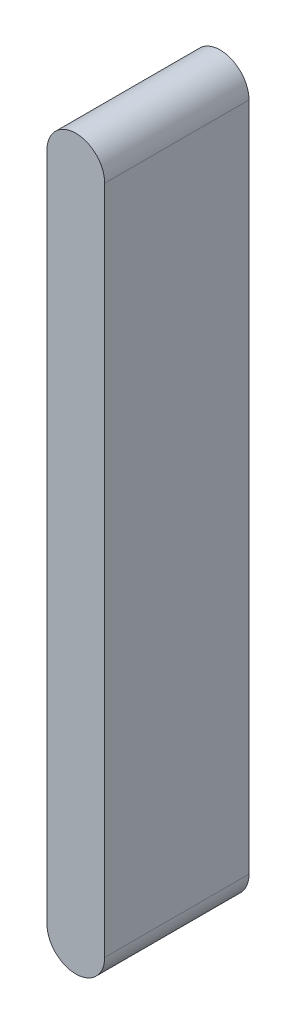
ISO-10303-21;
HEADER;
FILE_DESCRIPTION(('STEP AP214'),'2;1');
FILE_NAME('part.step','',(''),(''),'','','');
FILE_SCHEMA(('AUTOMOTIVE_DESIGN { 1 0 10303 214 1 1 1 1 }'));
ENDSEC;
DATA;
#1=APPLICATION_CONTEXT('core data for automotive mechanical design processes');
#2=APPLICATION_PROTOCOL_DEFINITION('international standard','automotive_design',2000,#1);
#3=PRODUCT_CONTEXT('',#1,'mechanical');
#4=PRODUCT('Part','Part','',(#3));
#5=PRODUCT_RELATED_PRODUCT_CATEGORY('part','',(#4));
#6=PRODUCT_DEFINITION_FORMATION('','',#4);
#7=PRODUCT_DEFINITION_CONTEXT('part definition',#1,'design');
#8=PRODUCT_DEFINITION('design','',#6,#7);
#9=PRODUCT_DEFINITION_SHAPE('','',#8);
#10=(LENGTH_UNIT() NAMED_UNIT(*) SI_UNIT(.MILLI.,.METRE.));
#11=(NAMED_UNIT(*) PLANE_ANGLE_UNIT() SI_UNIT($,.RADIAN.));
#12=(NAMED_UNIT(*) SI_UNIT($,.STERADIAN.) SOLID_ANGLE_UNIT());
#13=UNCERTAINTY_MEASURE_WITH_UNIT(LENGTH_MEASURE(1.E-05),#10,'distance_accuracy_value','');
#14=(GEOMETRIC_REPRESENTATION_CONTEXT(3) GLOBAL_UNCERTAINTY_ASSIGNED_CONTEXT((#13)) GLOBAL_UNIT_ASSIGNED_CONTEXT((#10,
#11,#12)) REPRESENTATION_CONTEXT('',''));
#15=CARTESIAN_POINT('',(0.,0.,0.));
#16=DIRECTION('',(0.,0.,1.));
#17=DIRECTION('',(1.,0.,0.));
#18=AXIS2_PLACEMENT_3D('',#15,#16,#17);
#19=CARTESIAN_POINT('',(-1.15,5.787332622142,-0.375));
#20=DIRECTION('',(1.,0.,0.));
#21=DIRECTION('',(0.,1.,0.));
#22=AXIS2_PLACEMENT_3D('',#19,#20,#21);
#23=PLANE('',#22);
#24=DIRECTION('',(0.,-1.,0.));
#25=VECTOR('',#24,1.);
#26=CARTESIAN_POINT('',(-1.15,5.787332622142,0.375));
#27=LINE('',#26,#25);
#28=CARTESIAN_POINT('',(-1.15,5.787332622142,0.375));
#29=VERTEX_POINT('',#28);
#30=CARTESIAN_POINT('',(-1.15,2.302902790585,0.375));
#31=VERTEX_POINT('',#30);
#32=EDGE_CURVE('E72',#29,#31,#27,.T.);
#33=ORIENTED_EDGE('',*,*,#32,.F.);
#34=DIRECTION('',(0.,0.,1.));
#35=VECTOR('',#34,1.);
#36=CARTESIAN_POINT('',(-1.15,5.787332622142,-0.375));
#37=LINE('',#36,#35);
#38=CARTESIAN_POINT('',(-1.15,5.787332622142,-0.375));
#39=VERTEX_POINT('',#38);
#40=EDGE_CURVE('E67',#39,#29,#37,.T.);
#41=ORIENTED_EDGE('',*,*,#40,.F.);
#42=DIRECTION('',(0.,-1.,0.));
#43=VECTOR('',#42,1.);
#44=CARTESIAN_POINT('',(-1.15,5.787332622142,-0.375));
#45=LINE('',#44,#43);
#46=CARTESIAN_POINT('',(-1.15,2.302902790585,-0.375));
#47=VERTEX_POINT('',#46);
#48=EDGE_CURVE('E69',#39,#47,#45,.T.);
#49=ORIENTED_EDGE('',*,*,#48,.T.);
#50=DIRECTION('',(0.,0.,-1.));
#51=VECTOR('',#50,1.);
#52=CARTESIAN_POINT('',(-1.15,2.302902790585,0.375));
#53=LINE('',#52,#51);
#54=EDGE_CURVE('E11',#31,#47,#53,.T.);
#55=ORIENTED_EDGE('',*,*,#54,.F.);
#56=EDGE_LOOP('',(#33,#41,#49,#55));
#57=FACE_BOUND('',#56,.T.);
#58=ADVANCED_FACE('F17',(#57),#23,.F.);
#59=CARTESIAN_POINT('',(-1.,2.302902790585,-0.375));
#60=DIRECTION('',(0.,0.,1.));
#61=DIRECTION('',(1.,0.,0.));
#62=AXIS2_PLACEMENT_3D('',#59,#60,#61);
#63=CYLINDRICAL_SURFACE('',#62,0.15);
#64=CARTESIAN_POINT('',(-1.,2.302902790585,0.375));
#65=DIRECTION('',(0.,0.,1.));
#66=DIRECTION('',(-1.,0.,0.));
#67=AXIS2_PLACEMENT_3D('',#64,#65,#66);
#68=CIRCLE('',#67,0.15);
#69=CARTESIAN_POINT('',(-0.85,2.302902790585,0.375));
#70=VERTEX_POINT('',#69);
#71=EDGE_CURVE('E102',#31,#70,#68,.T.);
#72=ORIENTED_EDGE('',*,*,#71,.F.);
#73=ORIENTED_EDGE('',*,*,#54,.T.);
#74=CARTESIAN_POINT('',(-1.,2.302902790585,-0.375));
#75=DIRECTION('',(0.,0.,-1.));
#76=DIRECTION('',(1.,0.,0.));
#77=AXIS2_PLACEMENT_3D('',#74,#75,#76);
#78=CIRCLE('',#77,0.15);
#79=CARTESIAN_POINT('',(-0.85,2.302902790585,-0.375));
#80=VERTEX_POINT('',#79);
#81=EDGE_CURVE('E85',#80,#47,#78,.T.);
#82=ORIENTED_EDGE('',*,*,#81,.F.);
#83=DIRECTION('',(0.,0.,1.));
#84=VECTOR('',#83,1.);
#85=CARTESIAN_POINT('',(-0.85,2.302902790585,-0.375));
#86=LINE('',#85,#84);
#87=EDGE_CURVE('E20',#80,#70,#86,.T.);
#88=ORIENTED_EDGE('',*,*,#87,.T.);
#89=EDGE_LOOP('',(#72,#73,#82,#88));
#90=FACE_BOUND('',#89,.T.);
#91=ADVANCED_FACE('F133',(#90),#63,.T.);
#92=CARTESIAN_POINT('',(-0.85,5.787332622142,-0.375));
#93=DIRECTION('',(-1.,0.,0.));
#94=DIRECTION('',(0.,0.,1.));
#95=AXIS2_PLACEMENT_3D('',#92,#93,#94);
#96=PLANE('',#95);
#97=DIRECTION('',(0.,1.,0.));
#98=VECTOR('',#97,1.);
#99=CARTESIAN_POINT('',(-0.85,2.302902790585,0.375));
#100=LINE('',#99,#98);
#101=CARTESIAN_POINT('',(-0.85,5.787332622142,0.375));
#102=VERTEX_POINT('',#101);
#103=EDGE_CURVE('E109',#70,#102,#100,.T.);
#104=ORIENTED_EDGE('',*,*,#103,.F.);
#105=ORIENTED_EDGE('',*,*,#87,.F.);
#106=DIRECTION('',(0.,1.,0.));
#107=VECTOR('',#106,1.);
#108=CARTESIAN_POINT('',(-0.85,2.302902790585,-0.375));
#109=LINE('',#108,#107);
#110=CARTESIAN_POINT('',(-0.85,5.787332622142,-0.375));
#111=VERTEX_POINT('',#110);
#112=EDGE_CURVE('E93',#80,#111,#109,.T.);
#113=ORIENTED_EDGE('',*,*,#112,.T.);
#114=DIRECTION('',(0.,0.,-1.));
#115=VECTOR('',#114,1.);
#116=CARTESIAN_POINT('',(-0.85,5.787332622142,0.375));
#117=LINE('',#116,#115);
#118=EDGE_CURVE('E78',#102,#111,#117,.T.);
#119=ORIENTED_EDGE('',*,*,#118,.F.);
#120=EDGE_LOOP('',(#104,#105,#113,#119));
#121=FACE_BOUND('',#120,.T.);
#122=ADVANCED_FACE('F140',(#121),#96,.F.);
#123=CARTESIAN_POINT('',(-1.,5.787332622142,0.375));
#124=DIRECTION('',(0.,0.,-1.));
#125=DIRECTION('',(0.,-1.,0.));
#126=AXIS2_PLACEMENT_3D('',#123,#124,#125);
#127=PLANE('',#126);
#128=CARTESIAN_POINT('',(-1.,5.787332622142,0.375));
#129=DIRECTION('',(0.,0.,1.));
#130=DIRECTION('',(1.,0.,0.));
#131=AXIS2_PLACEMENT_3D('',#128,#129,#130);
#132=CIRCLE('',#131,0.15);
#133=EDGE_CURVE('E87',#102,#29,#132,.T.);
#134=ORIENTED_EDGE('',*,*,#133,.T.);
#135=ORIENTED_EDGE('',*,*,#32,.T.);
#136=ORIENTED_EDGE('',*,*,#71,.T.);
#137=ORIENTED_EDGE('',*,*,#103,.T.);
#138=EDGE_LOOP('',(#134,#135,#136,#137));
#139=FACE_BOUND('',#138,.T.);
#140=ADVANCED_FACE('F147',(#139),#127,.F.);
#141=CARTESIAN_POINT('',(-1.,5.787332622142,-0.375));
#142=DIRECTION('',(0.,0.,1.));
#143=DIRECTION('',(1.,0.,0.));
#144=AXIS2_PLACEMENT_3D('',#141,#142,#143);
#145=CYLINDRICAL_SURFACE('',#144,0.15);
#146=ORIENTED_EDGE('',*,*,#133,.F.);
#147=ORIENTED_EDGE('',*,*,#118,.T.);
#148=CARTESIAN_POINT('',(-1.,5.787332622142,-0.375));
#149=DIRECTION('',(0.,0.,-1.));
#150=DIRECTION('',(-1.,0.,0.));
#151=AXIS2_PLACEMENT_3D('',#148,#149,#150);
#152=CIRCLE('',#151,0.15);
#153=EDGE_CURVE('E84',#39,#111,#152,.T.);
#154=ORIENTED_EDGE('',*,*,#153,.F.);
#155=ORIENTED_EDGE('',*,*,#40,.T.);
#156=EDGE_LOOP('',(#146,#147,#154,#155));
#157=FACE_BOUND('',#156,.T.);
#158=ADVANCED_FACE('F89',(#157),#145,.T.);
#159=CARTESIAN_POINT('',(-1.,5.787332622142,-0.375));
#160=DIRECTION('',(0.,0.,-1.));
#161=DIRECTION('',(0.,-1.,0.));
#162=AXIS2_PLACEMENT_3D('',#159,#160,#161);
#163=PLANE('',#162);
#164=ORIENTED_EDGE('',*,*,#153,.T.);
#165=ORIENTED_EDGE('',*,*,#112,.F.);
#166=ORIENTED_EDGE('',*,*,#81,.T.);
#167=ORIENTED_EDGE('',*,*,#48,.F.);
#168=EDGE_LOOP('',(#164,#165,#166,#167));
#169=FACE_BOUND('',#168,.T.);
#170=ADVANCED_FACE('F82',(#169),#163,.T.);
#171=CLOSED_SHELL('',(#58,#91,#122,#140,#158,#170));
#172=MANIFOLD_SOLID_BREP('B1',#171);
#173=ADVANCED_BREP_SHAPE_REPRESENTATION('',(#18,#172),#14);
#174=SHAPE_DEFINITION_REPRESENTATION(#9,#173);
ENDSEC;
END-ISO-10303-21;
